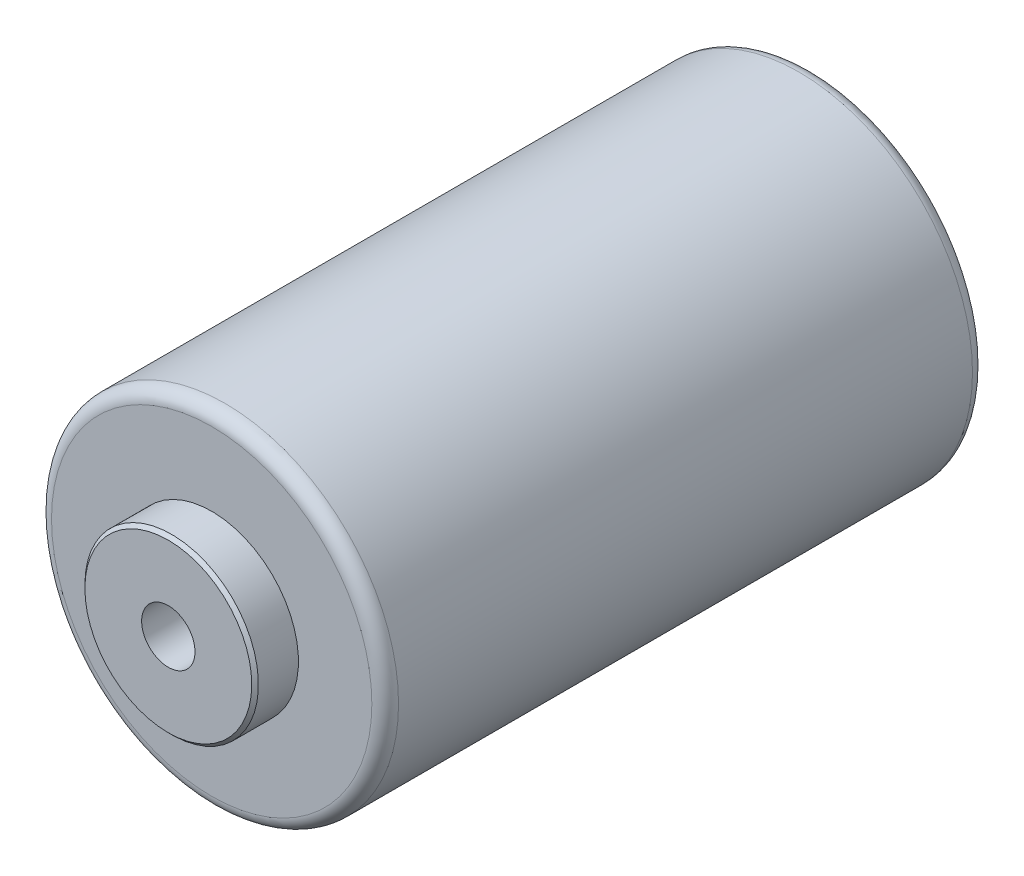
ISO-10303-21;
HEADER;
FILE_DESCRIPTION(('STEP AP214'),'2;1');
FILE_NAME('part.step','',(''),(''),'','','');
FILE_SCHEMA(('AUTOMOTIVE_DESIGN { 1 0 10303 214 1 1 1 1 }'));
ENDSEC;
DATA;
#1=APPLICATION_CONTEXT('core data for automotive mechanical design processes');
#2=APPLICATION_PROTOCOL_DEFINITION('international standard','automotive_design',2000,#1);
#3=PRODUCT_CONTEXT('',#1,'mechanical');
#4=PRODUCT('Part','Part','',(#3));
#5=PRODUCT_RELATED_PRODUCT_CATEGORY('part','',(#4));
#6=PRODUCT_DEFINITION_FORMATION('','',#4);
#7=PRODUCT_DEFINITION_CONTEXT('part definition',#1,'design');
#8=PRODUCT_DEFINITION('design','',#6,#7);
#9=PRODUCT_DEFINITION_SHAPE('','',#8);
#10=(LENGTH_UNIT() NAMED_UNIT(*) SI_UNIT(.MILLI.,.METRE.));
#11=(NAMED_UNIT(*) PLANE_ANGLE_UNIT() SI_UNIT($,.RADIAN.));
#12=(NAMED_UNIT(*) SI_UNIT($,.STERADIAN.) SOLID_ANGLE_UNIT());
#13=UNCERTAINTY_MEASURE_WITH_UNIT(LENGTH_MEASURE(1.E-05),#10,'distance_accuracy_value','');
#14=(GEOMETRIC_REPRESENTATION_CONTEXT(3) GLOBAL_UNCERTAINTY_ASSIGNED_CONTEXT((#13)) GLOBAL_UNIT_ASSIGNED_CONTEXT((#10,
#11,#12)) REPRESENTATION_CONTEXT('',''));
#15=CARTESIAN_POINT('',(0.,0.,0.));
#16=DIRECTION('',(0.,0.,1.));
#17=DIRECTION('',(1.,0.,0.));
#18=AXIS2_PLACEMENT_3D('',#15,#16,#17);
#19=CARTESIAN_POINT('',(0.,0.,90.));
#20=DIRECTION('',(0.,0.,-1.));
#21=DIRECTION('',(-1.,0.,0.));
#22=AXIS2_PLACEMENT_3D('',#19,#20,#21);
#23=CYLINDRICAL_SURFACE('',#22,26.);
#24=CARTESIAN_POINT('',(0.,0.,2.));
#25=DIRECTION('',(0.,0.,1.));
#26=DIRECTION('',(1.,0.,0.));
#27=AXIS2_PLACEMENT_3D('',#24,#25,#26);
#28=CIRCLE('',#27,26.);
#29=CARTESIAN_POINT('',(-26.,0.,1.99999999999999));
#30=VERTEX_POINT('',#29);
#31=EDGE_CURVE('E67',#30,#30,#28,.T.);
#32=CARTESIAN_POINT('',(0.,0.,88.));
#33=DIRECTION('',(0.,0.,1.));
#34=DIRECTION('',(1.,0.,0.));
#35=AXIS2_PLACEMENT_3D('',#32,#33,#34);
#36=CIRCLE('',#35,26.);
#37=CARTESIAN_POINT('',(-26.,0.,88.));
#38=VERTEX_POINT('',#37);
#39=EDGE_CURVE('E70',#38,#38,#36,.F.);
#40=CARTESIAN_POINT('',(-26.,0.,1.99999999999999));
#41=CARTESIAN_POINT('',(-26.,0.,2.89583333333332));
#42=CARTESIAN_POINT('',(-26.,0.,3.79166666666665));
#43=CARTESIAN_POINT('',(-26.,0.,5.58333333333332));
#44=CARTESIAN_POINT('',(-26.,0.,6.47916666666666));
#45=CARTESIAN_POINT('',(-26.,0.,8.27083333333333));
#46=CARTESIAN_POINT('',(-26.,0.,9.16666666666666));
#47=CARTESIAN_POINT('',(-26.,0.,10.9583333333333));
#48=CARTESIAN_POINT('',(-26.,0.,11.8541666666667));
#49=CARTESIAN_POINT('',(-26.,0.,13.6458333333333));
#50=CARTESIAN_POINT('',(-26.,0.,14.5416666666667));
#51=CARTESIAN_POINT('',(-26.,0.,16.3333333333333));
#52=CARTESIAN_POINT('',(-26.,0.,17.2291666666667));
#53=CARTESIAN_POINT('',(-26.,0.,19.0208333333333));
#54=CARTESIAN_POINT('',(-26.,0.,19.9166666666667));
#55=CARTESIAN_POINT('',(-26.,0.,21.7083333333333));
#56=CARTESIAN_POINT('',(-26.,0.,22.6041666666667));
#57=CARTESIAN_POINT('',(-26.,0.,24.3958333333333));
#58=CARTESIAN_POINT('',(-26.,0.,25.2916666666667));
#59=CARTESIAN_POINT('',(-26.,0.,27.0833333333333));
#60=CARTESIAN_POINT('',(-26.,0.,27.9791666666667));
#61=CARTESIAN_POINT('',(-26.,0.,29.7708333333333));
#62=CARTESIAN_POINT('',(-26.,0.,30.6666666666667));
#63=CARTESIAN_POINT('',(-26.,0.,32.4583333333333));
#64=CARTESIAN_POINT('',(-26.,0.,33.3541666666667));
#65=CARTESIAN_POINT('',(-26.,0.,35.1458333333333));
#66=CARTESIAN_POINT('',(-26.,0.,36.0416666666667));
#67=CARTESIAN_POINT('',(-26.,0.,37.8333333333333));
#68=CARTESIAN_POINT('',(-26.,0.,38.7291666666667));
#69=CARTESIAN_POINT('',(-26.,0.,40.5208333333333));
#70=CARTESIAN_POINT('',(-26.,0.,41.4166666666667));
#71=CARTESIAN_POINT('',(-26.,0.,43.2083333333333));
#72=CARTESIAN_POINT('',(-26.,0.,44.1041666666667));
#73=CARTESIAN_POINT('',(-26.,0.,45.8958333333333));
#74=CARTESIAN_POINT('',(-26.,0.,46.7916666666667));
#75=CARTESIAN_POINT('',(-26.,0.,48.5833333333333));
#76=CARTESIAN_POINT('',(-26.,0.,49.4791666666667));
#77=CARTESIAN_POINT('',(-26.,0.,51.2708333333333));
#78=CARTESIAN_POINT('',(-26.,0.,52.1666666666667));
#79=CARTESIAN_POINT('',(-26.,0.,53.9583333333333));
#80=CARTESIAN_POINT('',(-26.,0.,54.8541666666667));
#81=CARTESIAN_POINT('',(-26.,0.,56.6458333333333));
#82=CARTESIAN_POINT('',(-26.,0.,57.5416666666667));
#83=CARTESIAN_POINT('',(-26.,0.,59.3333333333333));
#84=CARTESIAN_POINT('',(-26.,0.,60.2291666666667));
#85=CARTESIAN_POINT('',(-26.,0.,62.0208333333333));
#86=CARTESIAN_POINT('',(-26.,0.,62.9166666666667));
#87=CARTESIAN_POINT('',(-26.,0.,64.7083333333333));
#88=CARTESIAN_POINT('',(-26.,0.,65.6041666666666));
#89=CARTESIAN_POINT('',(-26.,0.,67.3958333333333));
#90=CARTESIAN_POINT('',(-26.,0.,68.2916666666667));
#91=CARTESIAN_POINT('',(-26.,0.,70.0833333333333));
#92=CARTESIAN_POINT('',(-26.,0.,70.9791666666666));
#93=CARTESIAN_POINT('',(-26.,0.,72.7708333333333));
#94=CARTESIAN_POINT('',(-26.,0.,73.6666666666666));
#95=CARTESIAN_POINT('',(-26.,0.,75.4583333333333));
#96=CARTESIAN_POINT('',(-26.,0.,76.3541666666667));
#97=CARTESIAN_POINT('',(-26.,0.,78.1458333333333));
#98=CARTESIAN_POINT('',(-26.,0.,79.0416666666666));
#99=CARTESIAN_POINT('',(-26.,0.,80.8333333333333));
#100=CARTESIAN_POINT('',(-26.,0.,81.7291666666666));
#101=CARTESIAN_POINT('',(-26.,0.,83.5208333333333));
#102=CARTESIAN_POINT('',(-26.,0.,84.4166666666667));
#103=CARTESIAN_POINT('',(-26.,0.,86.2083333333333));
#104=CARTESIAN_POINT('',(-26.,0.,87.1041666666666));
#105=CARTESIAN_POINT('',(-26.,0.,88.));
#106=B_SPLINE_CURVE_WITH_KNOTS('',3,(#40,#41,#42,#43,#44,#45,#46,#47,#48,#49,#50,#51,#52,#53,
#54,#55,#56,#57,#58,#59,#60,#61,#62,#63,#64,#65,#66,#67,#68,#69,#70,#71,#72,#73,#74,#75,#76,#77,
#78,#79,#80,#81,#82,#83,#84,#85,#86,#87,#88,#89,#90,#91,#92,#93,#94,#95,#96,#97,#98,#99,#100,
#101,#102,#103,#104,#105),.UNSPECIFIED.,.F.,.F.,(4,2,2,2,2,2,2,2,2,2,2,2,2,2,2,2,2,2,2,2,2,2,2,
2,2,2,2,2,2,2,2,2,4),(0.,2.6875,5.375,8.0625,10.75,13.4375,16.125,18.8125,21.5,24.1875,26.875,
29.5625,32.25,34.9375,37.625,40.3125,43.,45.6875,48.375,51.0625,53.75,56.4375,59.125,61.8125,
64.5,67.1875,69.875,72.5625,75.25,77.9375,80.625,83.3125,86.),.UNSPECIFIED.);
#107=EDGE_CURVE('BSEAM37',#30,#38,#106,.T.);
#108=ORIENTED_EDGE('',*,*,#31,.T.);
#109=ORIENTED_EDGE('',*,*,#39,.T.);
#110=ORIENTED_EDGE('',*,*,#107,.T.);
#111=ORIENTED_EDGE('',*,*,#107,.F.);
#112=EDGE_LOOP('',(#108,#110,#109,#111));
#113=FACE_BOUND('',#112,.T.);
#114=ADVANCED_FACE('F37',(#113),#23,.T.);
#115=CARTESIAN_POINT('',(0.,0.,90.));
#116=DIRECTION('',(0.,0.,1.));
#117=DIRECTION('',(1.,0.,0.));
#118=AXIS2_PLACEMENT_3D('',#115,#116,#117);
#119=PLANE('',#118);
#120=CARTESIAN_POINT('',(0.,0.,90.));
#121=DIRECTION('',(0.,0.,1.));
#122=DIRECTION('',(1.,0.,0.));
#123=AXIS2_PLACEMENT_3D('',#120,#121,#122);
#124=CIRCLE('',#123,13.);
#125=CARTESIAN_POINT('',(-13.,0.,90.));
#126=VERTEX_POINT('',#125);
#127=EDGE_CURVE('E78',#126,#126,#124,.T.);
#128=ORIENTED_EDGE('',*,*,#127,.F.);
#129=EDGE_LOOP('',(#128));
#130=FACE_BOUND('',#129,.T.);
#131=CARTESIAN_POINT('',(0.,0.,90.));
#132=DIRECTION('',(0.,0.,1.));
#133=DIRECTION('',(1.,0.,0.));
#134=AXIS2_PLACEMENT_3D('',#131,#132,#133);
#135=CIRCLE('',#134,24.);
#136=CARTESIAN_POINT('',(24.,0.,90.));
#137=VERTEX_POINT('',#136);
#138=EDGE_CURVE('E61',#137,#137,#135,.T.);
#139=ORIENTED_EDGE('',*,*,#138,.T.);
#140=EDGE_LOOP('',(#139));
#141=FACE_BOUND('',#140,.T.);
#142=ADVANCED_FACE('F131',(#130,#141),#119,.T.);
#143=CARTESIAN_POINT('',(0.,0.,0.));
#144=DIRECTION('',(0.,0.,1.));
#145=DIRECTION('',(1.,0.,0.));
#146=AXIS2_PLACEMENT_3D('',#143,#144,#145);
#147=PLANE('',#146);
#148=CARTESIAN_POINT('',(17.5,0.,0.));
#149=DIRECTION('',(0.,0.,-1.));
#150=DIRECTION('',(-1.,0.,0.));
#151=AXIS2_PLACEMENT_3D('',#148,#149,#150);
#152=CIRCLE('',#151,1.6);
#153=CARTESIAN_POINT('',(15.9,0.,0.));
#154=VERTEX_POINT('',#153);
#155=EDGE_CURVE('E93',#154,#154,#152,.T.);
#156=ORIENTED_EDGE('',*,*,#155,.F.);
#157=EDGE_LOOP('',(#156));
#158=FACE_BOUND('',#157,.T.);
#159=CARTESIAN_POINT('',(0.,17.5,0.));
#160=DIRECTION('',(0.,0.,-1.));
#161=DIRECTION('',(-1.,0.,0.));
#162=AXIS2_PLACEMENT_3D('',#159,#160,#161);
#163=CIRCLE('',#162,1.6);
#164=CARTESIAN_POINT('',(-1.6,17.5,0.));
#165=VERTEX_POINT('',#164);
#166=EDGE_CURVE('E87',#165,#165,#163,.T.);
#167=ORIENTED_EDGE('',*,*,#166,.F.);
#168=EDGE_LOOP('',(#167));
#169=FACE_BOUND('',#168,.T.);
#170=CARTESIAN_POINT('',(-17.5,0.,0.));
#171=DIRECTION('',(0.,0.,-1.));
#172=DIRECTION('',(-1.,0.,0.));
#173=AXIS2_PLACEMENT_3D('',#170,#171,#172);
#174=CIRCLE('',#173,1.6);
#175=CARTESIAN_POINT('',(-19.1,0.,0.));
#176=VERTEX_POINT('',#175);
#177=EDGE_CURVE('E81',#176,#176,#174,.T.);
#178=ORIENTED_EDGE('',*,*,#177,.F.);
#179=EDGE_LOOP('',(#178));
#180=FACE_BOUND('',#179,.T.);
#181=CARTESIAN_POINT('',(0.,-17.5,0.));
#182=DIRECTION('',(0.,0.,-1.));
#183=DIRECTION('',(-1.,0.,0.));
#184=AXIS2_PLACEMENT_3D('',#181,#182,#183);
#185=CIRCLE('',#184,1.6);
#186=CARTESIAN_POINT('',(-1.6,-17.5,0.));
#187=VERTEX_POINT('',#186);
#188=EDGE_CURVE('E74',#187,#187,#185,.T.);
#189=ORIENTED_EDGE('',*,*,#188,.F.);
#190=EDGE_LOOP('',(#189));
#191=FACE_BOUND('',#190,.T.);
#192=CARTESIAN_POINT('',(0.,0.,0.));
#193=DIRECTION('',(0.,0.,1.));
#194=DIRECTION('',(1.,0.,0.));
#195=AXIS2_PLACEMENT_3D('',#192,#193,#194);
#196=CIRCLE('',#195,13.);
#197=CARTESIAN_POINT('',(13.,0.,0.));
#198=VERTEX_POINT('',#197);
#199=EDGE_CURVE('E58',#198,#198,#196,.F.);
#200=ORIENTED_EDGE('',*,*,#199,.F.);
#201=EDGE_LOOP('',(#200));
#202=FACE_BOUND('',#201,.T.);
#203=CARTESIAN_POINT('',(0.,0.,0.));
#204=DIRECTION('',(0.,0.,1.));
#205=DIRECTION('',(1.,0.,0.));
#206=AXIS2_PLACEMENT_3D('',#203,#204,#205);
#207=CIRCLE('',#206,24.);
#208=CARTESIAN_POINT('',(24.,0.,0.));
#209=VERTEX_POINT('',#208);
#210=EDGE_CURVE('E64',#209,#209,#207,.F.);
#211=ORIENTED_EDGE('',*,*,#210,.T.);
#212=EDGE_LOOP('',(#211));
#213=FACE_BOUND('',#212,.T.);
#214=ADVANCED_FACE('F137',(#158,#169,#180,#191,#202,#213),#147,.F.);
#215=CARTESIAN_POINT('',(0.,0.,2.));
#216=DIRECTION('',(0.,0.,1.));
#217=DIRECTION('',(1.,0.,0.));
#218=AXIS2_PLACEMENT_3D('',#215,#216,#217);
#219=TOROIDAL_SURFACE('',#218,24.,2.);
#220=ORIENTED_EDGE('',*,*,#210,.F.);
#221=EDGE_LOOP('',(#220));
#222=FACE_BOUND('',#221,.T.);
#223=ORIENTED_EDGE('',*,*,#31,.F.);
#224=EDGE_LOOP('',(#223));
#225=FACE_BOUND('',#224,.T.);
#226=ADVANCED_FACE('F143',(#222,#225),#219,.T.);
#227=CARTESIAN_POINT('',(0.,0.,88.));
#228=DIRECTION('',(0.,0.,1.));
#229=DIRECTION('',(1.,0.,0.));
#230=AXIS2_PLACEMENT_3D('',#227,#228,#229);
#231=TOROIDAL_SURFACE('',#230,24.,2.);
#232=ORIENTED_EDGE('',*,*,#39,.F.);
#233=EDGE_LOOP('',(#232));
#234=FACE_BOUND('',#233,.T.);
#235=ORIENTED_EDGE('',*,*,#138,.F.);
#236=EDGE_LOOP('',(#235));
#237=FACE_BOUND('',#236,.T.);
#238=ADVANCED_FACE('F128',(#234,#237),#231,.T.);
#239=CARTESIAN_POINT('',(0.,0.,-6.5));
#240=DIRECTION('',(0.,0.,1.));
#241=DIRECTION('',(1.,0.,0.));
#242=AXIS2_PLACEMENT_3D('',#239,#240,#241);
#243=CYLINDRICAL_SURFACE('',#242,13.);
#244=CARTESIAN_POINT('',(0.,0.,-6.00000000000003));
#245=DIRECTION('',(0.,0.,-1.));
#246=DIRECTION('',(-1.,0.,0.));
#247=AXIS2_PLACEMENT_3D('',#244,#245,#246);
#248=CIRCLE('',#247,13.);
#249=CARTESIAN_POINT('',(13.,0.,-6.00000000000003));
#250=VERTEX_POINT('',#249);
#251=EDGE_CURVE('E10',#250,#250,#248,.F.);
#252=CARTESIAN_POINT('',(13.,0.,-6.00000000000003));
#253=CARTESIAN_POINT('',(13.,0.,-5.93750000000003));
#254=CARTESIAN_POINT('',(13.,0.,-5.87500000000003));
#255=CARTESIAN_POINT('',(13.,0.,-5.75000000000003));
#256=CARTESIAN_POINT('',(13.,0.,-5.68750000000003));
#257=CARTESIAN_POINT('',(13.,0.,-5.56250000000003));
#258=CARTESIAN_POINT('',(13.,0.,-5.50000000000003));
#259=CARTESIAN_POINT('',(13.,0.,-5.37500000000003));
#260=CARTESIAN_POINT('',(13.,0.,-5.31250000000003));
#261=CARTESIAN_POINT('',(13.,0.,-5.18750000000003));
#262=CARTESIAN_POINT('',(13.,0.,-5.12500000000003));
#263=CARTESIAN_POINT('',(13.,0.,-5.00000000000003));
#264=CARTESIAN_POINT('',(13.,0.,-4.93750000000003));
#265=CARTESIAN_POINT('',(13.,0.,-4.81250000000003));
#266=CARTESIAN_POINT('',(13.,0.,-4.75000000000002));
#267=CARTESIAN_POINT('',(13.,0.,-4.62500000000002));
#268=CARTESIAN_POINT('',(13.,0.,-4.56250000000002));
#269=CARTESIAN_POINT('',(13.,0.,-4.43750000000002));
#270=CARTESIAN_POINT('',(13.,0.,-4.37500000000002));
#271=CARTESIAN_POINT('',(13.,0.,-4.25000000000002));
#272=CARTESIAN_POINT('',(13.,0.,-4.18750000000002));
#273=CARTESIAN_POINT('',(13.,0.,-4.06250000000002));
#274=CARTESIAN_POINT('',(13.,0.,-4.00000000000002));
#275=CARTESIAN_POINT('',(13.,0.,-3.87500000000002));
#276=CARTESIAN_POINT('',(13.,0.,-3.81250000000002));
#277=CARTESIAN_POINT('',(13.,0.,-3.68750000000002));
#278=CARTESIAN_POINT('',(13.,0.,-3.62500000000002));
#279=CARTESIAN_POINT('',(13.,0.,-3.50000000000002));
#280=CARTESIAN_POINT('',(13.,0.,-3.43750000000002));
#281=CARTESIAN_POINT('',(13.,0.,-3.31250000000002));
#282=CARTESIAN_POINT('',(13.,0.,-3.25000000000002));
#283=CARTESIAN_POINT('',(13.,0.,-3.12500000000002));
#284=CARTESIAN_POINT('',(13.,0.,-3.06250000000002));
#285=CARTESIAN_POINT('',(13.,0.,-2.93750000000002));
#286=CARTESIAN_POINT('',(13.,0.,-2.87500000000002));
#287=CARTESIAN_POINT('',(13.,0.,-2.75000000000001));
#288=CARTESIAN_POINT('',(13.,0.,-2.68750000000001));
#289=CARTESIAN_POINT('',(13.,0.,-2.56250000000001));
#290=CARTESIAN_POINT('',(13.,0.,-2.50000000000001));
#291=CARTESIAN_POINT('',(13.,0.,-2.37500000000001));
#292=CARTESIAN_POINT('',(13.,0.,-2.31250000000001));
#293=CARTESIAN_POINT('',(13.,0.,-2.18750000000001));
#294=CARTESIAN_POINT('',(13.,0.,-2.12500000000001));
#295=CARTESIAN_POINT('',(13.,0.,-2.00000000000001));
#296=CARTESIAN_POINT('',(13.,0.,-1.93750000000001));
#297=CARTESIAN_POINT('',(13.,0.,-1.81250000000001));
#298=CARTESIAN_POINT('',(13.,0.,-1.75000000000001));
#299=CARTESIAN_POINT('',(13.,0.,-1.62500000000001));
#300=CARTESIAN_POINT('',(13.,0.,-1.56250000000001));
#301=CARTESIAN_POINT('',(13.,0.,-1.43750000000001));
#302=CARTESIAN_POINT('',(13.,0.,-1.37500000000001));
#303=CARTESIAN_POINT('',(13.,0.,-1.25000000000001));
#304=CARTESIAN_POINT('',(13.,0.,-1.18750000000001));
#305=CARTESIAN_POINT('',(13.,0.,-1.06250000000001));
#306=CARTESIAN_POINT('',(13.,0.,-1.00000000000001));
#307=CARTESIAN_POINT('',(13.,0.,-0.875000000000004));
#308=CARTESIAN_POINT('',(13.,0.,-0.812500000000004));
#309=CARTESIAN_POINT('',(13.,0.,-0.687500000000004));
#310=CARTESIAN_POINT('',(13.,0.,-0.625000000000003));
#311=CARTESIAN_POINT('',(13.,0.,-0.500000000000002));
#312=CARTESIAN_POINT('',(13.,0.,-0.437500000000002));
#313=CARTESIAN_POINT('',(13.,0.,-0.312500000000001));
#314=CARTESIAN_POINT('',(13.,0.,-0.250000000000001));
#315=CARTESIAN_POINT('',(13.,0.,-0.125));
#316=CARTESIAN_POINT('',(13.,0.,-0.0625000000000001));
#317=CARTESIAN_POINT('',(13.,0.,0.));
#318=B_SPLINE_CURVE_WITH_KNOTS('',3,(#252,#253,#254,#255,#256,#257,#258,#259,#260,#261,#262,
#263,#264,#265,#266,#267,#268,#269,#270,#271,#272,#273,#274,#275,#276,#277,#278,#279,#280,#281,
#282,#283,#284,#285,#286,#287,#288,#289,#290,#291,#292,#293,#294,#295,#296,#297,#298,#299,#300,
#301,#302,#303,#304,#305,#306,#307,#308,#309,#310,#311,#312,#313,#314,#315,#316,#317),
.UNSPECIFIED.,.F.,.F.,(4,2,2,2,2,2,2,2,2,2,2,2,2,2,2,2,2,2,2,2,2,2,2,2,2,2,2,2,2,2,2,2,4),(0.,
0.187500000000001,0.375000000000002,0.562500000000003,0.750000000000004,0.937500000000005,
1.12500000000001,1.31250000000001,1.50000000000001,1.68750000000001,1.87500000000001,
2.06250000000001,2.25000000000001,2.43750000000001,2.62500000000001,2.81250000000002,
3.00000000000002,3.18750000000002,3.37500000000002,3.56250000000002,3.75000000000002,
3.93750000000002,4.12500000000002,4.31250000000002,4.50000000000002,4.68750000000003,
4.87500000000003,5.06250000000003,5.25000000000003,5.43750000000003,5.62500000000003,
5.81250000000003,6.00000000000003),.UNSPECIFIED.);
#319=EDGE_CURVE('BSEAM119',#250,#198,#318,.T.);
#320=ORIENTED_EDGE('',*,*,#251,.T.);
#321=ORIENTED_EDGE('',*,*,#199,.T.);
#322=ORIENTED_EDGE('',*,*,#319,.T.);
#323=ORIENTED_EDGE('',*,*,#319,.F.);
#324=EDGE_LOOP('',(#320,#322,#321,#323));
#325=FACE_BOUND('',#324,.T.);
#326=ADVANCED_FACE('F119',(#325),#243,.T.);
#327=CARTESIAN_POINT('',(0.,0.,-6.5));
#328=DIRECTION('',(0.,0.,-1.));
#329=DIRECTION('',(-1.,0.,0.));
#330=AXIS2_PLACEMENT_3D('',#327,#328,#329);
#331=PLANE('',#330);
#332=CARTESIAN_POINT('',(0.,0.,-6.5));
#333=DIRECTION('',(0.,0.,-1.));
#334=DIRECTION('',(-1.,0.,0.));
#335=AXIS2_PLACEMENT_3D('',#332,#333,#334);
#336=CIRCLE('',#335,4.);
#337=CARTESIAN_POINT('',(-4.,0.,-6.5));
#338=VERTEX_POINT('',#337);
#339=EDGE_CURVE('E101',#338,#338,#336,.T.);
#340=ORIENTED_EDGE('',*,*,#339,.F.);
#341=EDGE_LOOP('',(#340));
#342=FACE_BOUND('',#341,.T.);
#343=CARTESIAN_POINT('',(0.,0.,-6.5));
#344=DIRECTION('',(0.,0.,-1.));
#345=DIRECTION('',(-1.,0.,0.));
#346=AXIS2_PLACEMENT_3D('',#343,#344,#345);
#347=CIRCLE('',#346,12.5);
#348=CARTESIAN_POINT('',(-12.5,0.,-6.5));
#349=VERTEX_POINT('',#348);
#350=EDGE_CURVE('E45',#349,#349,#347,.T.);
#351=ORIENTED_EDGE('',*,*,#350,.T.);
#352=EDGE_LOOP('',(#351));
#353=FACE_BOUND('',#352,.T.);
#354=ADVANCED_FACE('F116',(#342,#353),#331,.T.);
#355=CARTESIAN_POINT('',(0.,-17.5,10.));
#356=DIRECTION('',(0.,0.,-1.));
#357=DIRECTION('',(-1.,0.,0.));
#358=AXIS2_PLACEMENT_3D('',#355,#356,#357);
#359=CYLINDRICAL_SURFACE('',#358,1.6);
#360=CARTESIAN_POINT('',(0.,-17.5,10.));
#361=DIRECTION('',(0.,0.,-1.));
#362=DIRECTION('',(-1.,0.,0.));
#363=AXIS2_PLACEMENT_3D('',#360,#361,#362);
#364=CIRCLE('',#363,1.6);
#365=CARTESIAN_POINT('',(-1.6,-17.5,10.));
#366=VERTEX_POINT('',#365);
#367=EDGE_CURVE('E77',#366,#366,#364,.T.);
#368=ORIENTED_EDGE('',*,*,#367,.F.);
#369=EDGE_LOOP('',(#368));
#370=FACE_BOUND('',#369,.T.);
#371=ORIENTED_EDGE('',*,*,#188,.T.);
#372=EDGE_LOOP('',(#371));
#373=FACE_BOUND('',#372,.T.);
#374=ADVANCED_FACE('F118',(#370,#373),#359,.F.);
#375=CARTESIAN_POINT('',(0.,-17.5,10.));
#376=DIRECTION('',(0.,0.,-1.));
#377=DIRECTION('',(-1.,0.,0.));
#378=AXIS2_PLACEMENT_3D('',#375,#376,#377);
#379=PLANE('',#378);
#380=ORIENTED_EDGE('',*,*,#367,.T.);
#381=EDGE_LOOP('',(#380));
#382=FACE_BOUND('',#381,.T.);
#383=ADVANCED_FACE('F125',(#382),#379,.T.);
#384=CARTESIAN_POINT('',(-17.5,0.,10.));
#385=DIRECTION('',(0.,0.,-1.));
#386=DIRECTION('',(-1.,0.,0.));
#387=AXIS2_PLACEMENT_3D('',#384,#385,#386);
#388=CYLINDRICAL_SURFACE('',#387,1.6);
#389=CARTESIAN_POINT('',(-17.5,0.,10.));
#390=DIRECTION('',(0.,0.,-1.));
#391=DIRECTION('',(-1.,0.,0.));
#392=AXIS2_PLACEMENT_3D('',#389,#390,#391);
#393=CIRCLE('',#392,1.6);
#394=CARTESIAN_POINT('',(-19.1,0.,10.));
#395=VERTEX_POINT('',#394);
#396=EDGE_CURVE('E84',#395,#395,#393,.T.);
#397=ORIENTED_EDGE('',*,*,#396,.F.);
#398=EDGE_LOOP('',(#397));
#399=FACE_BOUND('',#398,.T.);
#400=ORIENTED_EDGE('',*,*,#177,.T.);
#401=EDGE_LOOP('',(#400));
#402=FACE_BOUND('',#401,.T.);
#403=ADVANCED_FACE('F195',(#399,#402),#388,.F.);
#404=CARTESIAN_POINT('',(-17.5,0.,10.));
#405=DIRECTION('',(0.,0.,-1.));
#406=DIRECTION('',(-1.,0.,0.));
#407=AXIS2_PLACEMENT_3D('',#404,#405,#406);
#408=PLANE('',#407);
#409=ORIENTED_EDGE('',*,*,#396,.T.);
#410=EDGE_LOOP('',(#409));
#411=FACE_BOUND('',#410,.T.);
#412=ADVANCED_FACE('F191',(#411),#408,.T.);
#413=CARTESIAN_POINT('',(0.,17.5,10.));
#414=DIRECTION('',(0.,0.,-1.));
#415=DIRECTION('',(-1.,0.,0.));
#416=AXIS2_PLACEMENT_3D('',#413,#414,#415);
#417=CYLINDRICAL_SURFACE('',#416,1.6);
#418=CARTESIAN_POINT('',(0.,17.5,10.));
#419=DIRECTION('',(0.,0.,-1.));
#420=DIRECTION('',(-1.,0.,0.));
#421=AXIS2_PLACEMENT_3D('',#418,#419,#420);
#422=CIRCLE('',#421,1.6);
#423=CARTESIAN_POINT('',(-1.6,17.5,10.));
#424=VERTEX_POINT('',#423);
#425=EDGE_CURVE('E90',#424,#424,#422,.T.);
#426=ORIENTED_EDGE('',*,*,#425,.F.);
#427=EDGE_LOOP('',(#426));
#428=FACE_BOUND('',#427,.T.);
#429=ORIENTED_EDGE('',*,*,#166,.T.);
#430=EDGE_LOOP('',(#429));
#431=FACE_BOUND('',#430,.T.);
#432=ADVANCED_FACE('F187',(#428,#431),#417,.F.);
#433=CARTESIAN_POINT('',(0.,17.5,10.));
#434=DIRECTION('',(0.,0.,-1.));
#435=DIRECTION('',(-1.,0.,0.));
#436=AXIS2_PLACEMENT_3D('',#433,#434,#435);
#437=PLANE('',#436);
#438=ORIENTED_EDGE('',*,*,#425,.T.);
#439=EDGE_LOOP('',(#438));
#440=FACE_BOUND('',#439,.T.);
#441=ADVANCED_FACE('F183',(#440),#437,.T.);
#442=CARTESIAN_POINT('',(17.5,0.,10.));
#443=DIRECTION('',(0.,0.,-1.));
#444=DIRECTION('',(-1.,0.,0.));
#445=AXIS2_PLACEMENT_3D('',#442,#443,#444);
#446=CYLINDRICAL_SURFACE('',#445,1.6);
#447=CARTESIAN_POINT('',(17.5,0.,10.));
#448=DIRECTION('',(0.,0.,-1.));
#449=DIRECTION('',(-1.,0.,0.));
#450=AXIS2_PLACEMENT_3D('',#447,#448,#449);
#451=CIRCLE('',#450,1.6);
#452=CARTESIAN_POINT('',(15.9,0.,10.));
#453=VERTEX_POINT('',#452);
#454=EDGE_CURVE('E73',#453,#453,#451,.T.);
#455=ORIENTED_EDGE('',*,*,#454,.F.);
#456=EDGE_LOOP('',(#455));
#457=FACE_BOUND('',#456,.T.);
#458=ORIENTED_EDGE('',*,*,#155,.T.);
#459=EDGE_LOOP('',(#458));
#460=FACE_BOUND('',#459,.T.);
#461=ADVANCED_FACE('F177',(#457,#460),#446,.F.);
#462=CARTESIAN_POINT('',(17.5,0.,10.));
#463=DIRECTION('',(0.,0.,-1.));
#464=DIRECTION('',(-1.,0.,0.));
#465=AXIS2_PLACEMENT_3D('',#462,#463,#464);
#466=PLANE('',#465);
#467=ORIENTED_EDGE('',*,*,#454,.T.);
#468=EDGE_LOOP('',(#467));
#469=FACE_BOUND('',#468,.T.);
#470=ADVANCED_FACE('F168',(#469),#466,.T.);
#471=CARTESIAN_POINT('',(0.,0.,96.5));
#472=DIRECTION('',(0.,0.,-1.));
#473=DIRECTION('',(-1.,0.,0.));
#474=AXIS2_PLACEMENT_3D('',#471,#472,#473);
#475=CYLINDRICAL_SURFACE('',#474,13.);
#476=CARTESIAN_POINT('',(0.,0.,96.));
#477=DIRECTION('',(0.,0.,1.));
#478=DIRECTION('',(1.,0.,0.));
#479=AXIS2_PLACEMENT_3D('',#476,#477,#478);
#480=CIRCLE('',#479,13.);
#481=CARTESIAN_POINT('',(-13.,0.,96.));
#482=VERTEX_POINT('',#481);
#483=EDGE_CURVE('E49',#482,#482,#480,.F.);
#484=CARTESIAN_POINT('',(-13.,0.,96.));
#485=CARTESIAN_POINT('',(-13.,0.,95.9375));
#486=CARTESIAN_POINT('',(-13.,0.,95.875));
#487=CARTESIAN_POINT('',(-13.,0.,95.75));
#488=CARTESIAN_POINT('',(-13.,0.,95.6875));
#489=CARTESIAN_POINT('',(-13.,0.,95.5625));
#490=CARTESIAN_POINT('',(-13.,0.,95.5));
#491=CARTESIAN_POINT('',(-13.,0.,95.375));
#492=CARTESIAN_POINT('',(-13.,0.,95.3125));
#493=CARTESIAN_POINT('',(-13.,0.,95.1875));
#494=CARTESIAN_POINT('',(-13.,0.,95.125));
#495=CARTESIAN_POINT('',(-13.,0.,95.));
#496=CARTESIAN_POINT('',(-13.,0.,94.9375));
#497=CARTESIAN_POINT('',(-13.,0.,94.8125));
#498=CARTESIAN_POINT('',(-13.,0.,94.75));
#499=CARTESIAN_POINT('',(-13.,0.,94.625));
#500=CARTESIAN_POINT('',(-13.,0.,94.5625));
#501=CARTESIAN_POINT('',(-13.,0.,94.4375));
#502=CARTESIAN_POINT('',(-13.,0.,94.375));
#503=CARTESIAN_POINT('',(-13.,0.,94.25));
#504=CARTESIAN_POINT('',(-13.,0.,94.1875));
#505=CARTESIAN_POINT('',(-13.,0.,94.0625));
#506=CARTESIAN_POINT('',(-13.,0.,94.));
#507=CARTESIAN_POINT('',(-13.,0.,93.875));
#508=CARTESIAN_POINT('',(-13.,0.,93.8125));
#509=CARTESIAN_POINT('',(-13.,0.,93.6875));
#510=CARTESIAN_POINT('',(-13.,0.,93.625));
#511=CARTESIAN_POINT('',(-13.,0.,93.5));
#512=CARTESIAN_POINT('',(-13.,0.,93.4375));
#513=CARTESIAN_POINT('',(-13.,0.,93.3125));
#514=CARTESIAN_POINT('',(-13.,0.,93.25));
#515=CARTESIAN_POINT('',(-13.,0.,93.125));
#516=CARTESIAN_POINT('',(-13.,0.,93.0625));
#517=CARTESIAN_POINT('',(-13.,0.,92.9375));
#518=CARTESIAN_POINT('',(-13.,0.,92.875));
#519=CARTESIAN_POINT('',(-13.,0.,92.75));
#520=CARTESIAN_POINT('',(-13.,0.,92.6875));
#521=CARTESIAN_POINT('',(-13.,0.,92.5625));
#522=CARTESIAN_POINT('',(-13.,0.,92.5));
#523=CARTESIAN_POINT('',(-13.,0.,92.375));
#524=CARTESIAN_POINT('',(-13.,0.,92.3125));
#525=CARTESIAN_POINT('',(-13.,0.,92.1875));
#526=CARTESIAN_POINT('',(-13.,0.,92.125));
#527=CARTESIAN_POINT('',(-13.,0.,92.));
#528=CARTESIAN_POINT('',(-13.,0.,91.9375));
#529=CARTESIAN_POINT('',(-13.,0.,91.8125));
#530=CARTESIAN_POINT('',(-13.,0.,91.75));
#531=CARTESIAN_POINT('',(-13.,0.,91.625));
#532=CARTESIAN_POINT('',(-13.,0.,91.5625));
#533=CARTESIAN_POINT('',(-13.,0.,91.4375));
#534=CARTESIAN_POINT('',(-13.,0.,91.375));
#535=CARTESIAN_POINT('',(-13.,0.,91.25));
#536=CARTESIAN_POINT('',(-13.,0.,91.1875));
#537=CARTESIAN_POINT('',(-13.,0.,91.0625));
#538=CARTESIAN_POINT('',(-13.,0.,91.));
#539=CARTESIAN_POINT('',(-13.,0.,90.875));
#540=CARTESIAN_POINT('',(-13.,0.,90.8125));
#541=CARTESIAN_POINT('',(-13.,0.,90.6875));
#542=CARTESIAN_POINT('',(-13.,0.,90.625));
#543=CARTESIAN_POINT('',(-13.,0.,90.5));
#544=CARTESIAN_POINT('',(-13.,0.,90.4375));
#545=CARTESIAN_POINT('',(-13.,0.,90.3125));
#546=CARTESIAN_POINT('',(-13.,0.,90.25));
#547=CARTESIAN_POINT('',(-13.,0.,90.125));
#548=CARTESIAN_POINT('',(-13.,0.,90.0625));
#549=CARTESIAN_POINT('',(-13.,0.,90.));
#550=B_SPLINE_CURVE_WITH_KNOTS('',3,(#484,#485,#486,#487,#488,#489,#490,#491,#492,#493,#494,
#495,#496,#497,#498,#499,#500,#501,#502,#503,#504,#505,#506,#507,#508,#509,#510,#511,#512,#513,
#514,#515,#516,#517,#518,#519,#520,#521,#522,#523,#524,#525,#526,#527,#528,#529,#530,#531,#532,
#533,#534,#535,#536,#537,#538,#539,#540,#541,#542,#543,#544,#545,#546,#547,#548,#549),
.UNSPECIFIED.,.F.,.F.,(4,2,2,2,2,2,2,2,2,2,2,2,2,2,2,2,2,2,2,2,2,2,2,2,2,2,2,2,2,2,2,2,4),(0.,
0.187500000000007,0.375000000000014,0.562500000000007,0.750000000000015,0.937500000000008,
1.12500000000001,1.31250000000002,1.50000000000002,1.68750000000002,1.87500000000002,
2.06250000000002,2.25000000000003,2.43750000000002,2.62500000000003,2.81250000000002,
3.00000000000003,3.18750000000004,3.37500000000003,3.56250000000004,3.75000000000003,
3.93750000000004,4.12500000000005,4.31250000000004,4.50000000000005,4.68750000000004,
4.87500000000005,5.06250000000005,5.25000000000005,5.43750000000005,5.62500000000005,
5.81250000000005,6.00000000000006),.UNSPECIFIED.);
#551=EDGE_CURVE('BSEAM160',#482,#126,#550,.T.);
#552=ORIENTED_EDGE('',*,*,#483,.T.);
#553=ORIENTED_EDGE('',*,*,#127,.T.);
#554=ORIENTED_EDGE('',*,*,#551,.T.);
#555=ORIENTED_EDGE('',*,*,#551,.F.);
#556=EDGE_LOOP('',(#552,#554,#553,#555));
#557=FACE_BOUND('',#556,.T.);
#558=ADVANCED_FACE('F160',(#557),#475,.T.);
#559=CARTESIAN_POINT('',(0.,0.,96.5));
#560=DIRECTION('',(0.,0.,1.));
#561=DIRECTION('',(1.,0.,0.));
#562=AXIS2_PLACEMENT_3D('',#559,#560,#561);
#563=PLANE('',#562);
#564=CARTESIAN_POINT('',(0.,0.,96.5));
#565=DIRECTION('',(0.,0.,-1.));
#566=DIRECTION('',(-1.,0.,0.));
#567=AXIS2_PLACEMENT_3D('',#564,#565,#566);
#568=CIRCLE('',#567,4.);
#569=CARTESIAN_POINT('',(-4.,0.,96.5));
#570=VERTEX_POINT('',#569);
#571=EDGE_CURVE('E100',#570,#570,#568,.T.);
#572=ORIENTED_EDGE('',*,*,#571,.T.);
#573=EDGE_LOOP('',(#572));
#574=FACE_BOUND('',#573,.T.);
#575=CARTESIAN_POINT('',(0.,0.,96.5));
#576=DIRECTION('',(0.,0.,1.));
#577=DIRECTION('',(1.,0.,0.));
#578=AXIS2_PLACEMENT_3D('',#575,#576,#577);
#579=CIRCLE('',#578,12.5);
#580=CARTESIAN_POINT('',(12.5,0.,96.5));
#581=VERTEX_POINT('',#580);
#582=EDGE_CURVE('E53',#581,#581,#579,.T.);
#583=ORIENTED_EDGE('',*,*,#582,.T.);
#584=EDGE_LOOP('',(#583));
#585=FACE_BOUND('',#584,.T.);
#586=ADVANCED_FACE('F107',(#574,#585),#563,.T.);
#587=CARTESIAN_POINT('',(0.,0.,96.5));
#588=DIRECTION('',(0.,0.,-1.));
#589=DIRECTION('',(-1.,0.,0.));
#590=AXIS2_PLACEMENT_3D('',#587,#588,#589);
#591=CONICAL_SURFACE('',#590,12.5,0.785398163397464);
#592=ORIENTED_EDGE('',*,*,#483,.F.);
#593=EDGE_LOOP('',(#592));
#594=FACE_BOUND('',#593,.T.);
#595=ORIENTED_EDGE('',*,*,#582,.F.);
#596=EDGE_LOOP('',(#595));
#597=FACE_BOUND('',#596,.T.);
#598=ADVANCED_FACE('F150',(#594,#597),#591,.T.);
#599=CARTESIAN_POINT('',(0.,0.,-6.5));
#600=DIRECTION('',(0.,0.,1.));
#601=DIRECTION('',(1.,0.,0.));
#602=AXIS2_PLACEMENT_3D('',#599,#600,#601);
#603=CONICAL_SURFACE('',#602,12.5,0.785398163397459);
#604=ORIENTED_EDGE('',*,*,#251,.F.);
#605=EDGE_LOOP('',(#604));
#606=FACE_BOUND('',#605,.T.);
#607=ORIENTED_EDGE('',*,*,#350,.F.);
#608=EDGE_LOOP('',(#607));
#609=FACE_BOUND('',#608,.T.);
#610=ADVANCED_FACE('F40',(#606,#609),#603,.T.);
#611=CARTESIAN_POINT('',(0.,0.,96.5));
#612=DIRECTION('',(0.,0.,-1.));
#613=DIRECTION('',(-1.,0.,0.));
#614=AXIS2_PLACEMENT_3D('',#611,#612,#613);
#615=CYLINDRICAL_SURFACE('',#614,4.);
#616=ORIENTED_EDGE('',*,*,#571,.F.);
#617=EDGE_LOOP('',(#616));
#618=FACE_BOUND('',#617,.T.);
#619=ORIENTED_EDGE('',*,*,#339,.T.);
#620=EDGE_LOOP('',(#619));
#621=FACE_BOUND('',#620,.T.);
#622=ADVANCED_FACE('F110',(#618,#621),#615,.F.);
#623=CLOSED_SHELL('',(#114,#142,#214,#226,#238,#326,#354,#374,#383,#403,#412,#432,#441,#461,
#470,#558,#586,#598,#610,#622));
#624=MANIFOLD_SOLID_BREP('B2',#623);
#625=ADVANCED_BREP_SHAPE_REPRESENTATION('',(#18,#624),#14);
#626=SHAPE_DEFINITION_REPRESENTATION(#9,#625);
ENDSEC;
END-ISO-10303-21;
